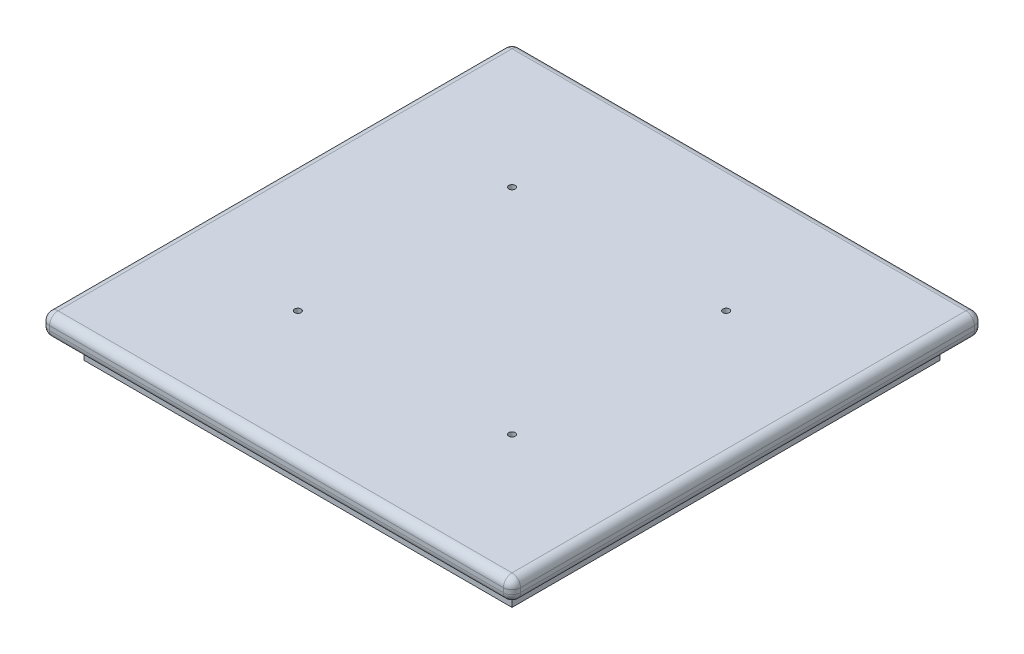
ISO-10303-21;
HEADER;
FILE_DESCRIPTION(('STEP AP214'),'2;1');
FILE_NAME('part.step','',(''),(''),'','','');
FILE_SCHEMA(('AUTOMOTIVE_DESIGN { 1 0 10303 214 1 1 1 1 }'));
ENDSEC;
DATA;
#1=APPLICATION_CONTEXT('core data for automotive mechanical design processes');
#2=APPLICATION_PROTOCOL_DEFINITION('international standard','automotive_design',2000,#1);
#3=PRODUCT_CONTEXT('',#1,'mechanical');
#4=PRODUCT('Part','Part','',(#3));
#5=PRODUCT_RELATED_PRODUCT_CATEGORY('part','',(#4));
#6=PRODUCT_DEFINITION_FORMATION('','',#4);
#7=PRODUCT_DEFINITION_CONTEXT('part definition',#1,'design');
#8=PRODUCT_DEFINITION('design','',#6,#7);
#9=PRODUCT_DEFINITION_SHAPE('','',#8);
#10=(LENGTH_UNIT() NAMED_UNIT(*) SI_UNIT(.MILLI.,.METRE.));
#11=(NAMED_UNIT(*) PLANE_ANGLE_UNIT() SI_UNIT($,.RADIAN.));
#12=(NAMED_UNIT(*) SI_UNIT($,.STERADIAN.) SOLID_ANGLE_UNIT());
#13=UNCERTAINTY_MEASURE_WITH_UNIT(LENGTH_MEASURE(1.E-05),#10,'distance_accuracy_value','');
#14=(GEOMETRIC_REPRESENTATION_CONTEXT(3) GLOBAL_UNCERTAINTY_ASSIGNED_CONTEXT((#13)) GLOBAL_UNIT_ASSIGNED_CONTEXT((#10,
#11,#12)) REPRESENTATION_CONTEXT('',''));
#15=CARTESIAN_POINT('',(0.,0.,0.));
#16=DIRECTION('',(0.,0.,1.));
#17=DIRECTION('',(1.,0.,0.));
#18=AXIS2_PLACEMENT_3D('',#15,#16,#17);
#19=CARTESIAN_POINT('',(-50.,10.,-50.));
#20=DIRECTION('',(1.,0.,0.));
#21=DIRECTION('',(0.,0.,-1.));
#22=AXIS2_PLACEMENT_3D('',#19,#20,#21);
#23=PLANE('',#22);
#24=DIRECTION('',(0.,0.,1.));
#25=VECTOR('',#24,1.);
#26=CARTESIAN_POINT('',(-50.,5.,-50.));
#27=LINE('',#26,#25);
#28=CARTESIAN_POINT('',(-50.,5.,-50.));
#29=VERTEX_POINT('',#28);
#30=CARTESIAN_POINT('',(-50.,5.,50.));
#31=VERTEX_POINT('',#30);
#32=EDGE_CURVE('E164',#29,#31,#27,.T.);
#33=ORIENTED_EDGE('',*,*,#32,.F.);
#34=DIRECTION('',(0.,-1.,0.));
#35=VECTOR('',#34,1.);
#36=CARTESIAN_POINT('',(-50.,10.,-50.));
#37=LINE('',#36,#35);
#38=CARTESIAN_POINT('',(-50.,0.,-50.));
#39=VERTEX_POINT('',#38);
#40=EDGE_CURVE('E149',#29,#39,#37,.T.);
#41=ORIENTED_EDGE('',*,*,#40,.T.);
#42=DIRECTION('',(0.,0.,1.));
#43=VECTOR('',#42,1.);
#44=CARTESIAN_POINT('',(-50.,0.,-50.));
#45=LINE('',#44,#43);
#46=CARTESIAN_POINT('',(-50.,0.,50.));
#47=VERTEX_POINT('',#46);
#48=EDGE_CURVE('E199',#39,#47,#45,.T.);
#49=ORIENTED_EDGE('',*,*,#48,.T.);
#50=DIRECTION('',(0.,-1.,0.));
#51=VECTOR('',#50,1.);
#52=CARTESIAN_POINT('',(-50.,10.,50.));
#53=LINE('',#52,#51);
#54=EDGE_CURVE('E165',#31,#47,#53,.T.);
#55=ORIENTED_EDGE('',*,*,#54,.F.);
#56=EDGE_LOOP('',(#33,#41,#49,#55));
#57=FACE_BOUND('',#56,.T.);
#58=ADVANCED_FACE('F37',(#57),#23,.F.);
#59=CARTESIAN_POINT('',(50.,10.,50.));
#60=DIRECTION('',(0.,0.,-1.));
#61=DIRECTION('',(-1.,0.,0.));
#62=AXIS2_PLACEMENT_3D('',#59,#60,#61);
#63=PLANE('',#62);
#64=DIRECTION('',(1.,0.,0.));
#65=VECTOR('',#64,1.);
#66=CARTESIAN_POINT('',(50.,5.,50.));
#67=LINE('',#66,#65);
#68=CARTESIAN_POINT('',(50.,5.,50.));
#69=VERTEX_POINT('',#68);
#70=EDGE_CURVE('E168',#31,#69,#67,.T.);
#71=ORIENTED_EDGE('',*,*,#70,.F.);
#72=ORIENTED_EDGE('',*,*,#54,.T.);
#73=DIRECTION('',(1.,0.,0.));
#74=VECTOR('',#73,1.);
#75=CARTESIAN_POINT('',(50.,0.,50.));
#76=LINE('',#75,#74);
#77=CARTESIAN_POINT('',(50.,0.,50.));
#78=VERTEX_POINT('',#77);
#79=EDGE_CURVE('E203',#47,#78,#76,.T.);
#80=ORIENTED_EDGE('',*,*,#79,.T.);
#81=DIRECTION('',(0.,-1.,0.));
#82=VECTOR('',#81,1.);
#83=CARTESIAN_POINT('',(50.,10.,50.));
#84=LINE('',#83,#82);
#85=EDGE_CURVE('E211',#69,#78,#84,.T.);
#86=ORIENTED_EDGE('',*,*,#85,.F.);
#87=EDGE_LOOP('',(#71,#72,#80,#86));
#88=FACE_BOUND('',#87,.T.);
#89=ADVANCED_FACE('F421',(#88),#63,.F.);
#90=CARTESIAN_POINT('',(50.,10.,-50.));
#91=DIRECTION('',(-1.,0.,0.));
#92=DIRECTION('',(0.,0.,1.));
#93=AXIS2_PLACEMENT_3D('',#90,#91,#92);
#94=PLANE('',#93);
#95=DIRECTION('',(0.,0.,-1.));
#96=VECTOR('',#95,1.);
#97=CARTESIAN_POINT('',(50.,5.,-50.));
#98=LINE('',#97,#96);
#99=CARTESIAN_POINT('',(50.,5.,-50.));
#100=VERTEX_POINT('',#99);
#101=EDGE_CURVE('E172',#69,#100,#98,.T.);
#102=ORIENTED_EDGE('',*,*,#101,.F.);
#103=ORIENTED_EDGE('',*,*,#85,.T.);
#104=DIRECTION('',(0.,0.,-1.));
#105=VECTOR('',#104,1.);
#106=CARTESIAN_POINT('',(50.,0.,-50.));
#107=LINE('',#106,#105);
#108=CARTESIAN_POINT('',(50.,0.,-50.));
#109=VERTEX_POINT('',#108);
#110=EDGE_CURVE('E206',#78,#109,#107,.T.);
#111=ORIENTED_EDGE('',*,*,#110,.T.);
#112=DIRECTION('',(0.,-1.,0.));
#113=VECTOR('',#112,1.);
#114=CARTESIAN_POINT('',(50.,10.,-50.));
#115=LINE('',#114,#113);
#116=EDGE_CURVE('E160',#100,#109,#115,.T.);
#117=ORIENTED_EDGE('',*,*,#116,.F.);
#118=EDGE_LOOP('',(#102,#103,#111,#117));
#119=FACE_BOUND('',#118,.T.);
#120=ADVANCED_FACE('F426',(#119),#94,.F.);
#121=CARTESIAN_POINT('',(50.,10.,-50.));
#122=DIRECTION('',(0.,0.,1.));
#123=DIRECTION('',(1.,0.,0.));
#124=AXIS2_PLACEMENT_3D('',#121,#122,#123);
#125=PLANE('',#124);
#126=DIRECTION('',(-1.,0.,0.));
#127=VECTOR('',#126,1.);
#128=CARTESIAN_POINT('',(50.,5.,-50.));
#129=LINE('',#128,#127);
#130=EDGE_CURVE('E153',#100,#29,#129,.T.);
#131=ORIENTED_EDGE('',*,*,#130,.F.);
#132=ORIENTED_EDGE('',*,*,#116,.T.);
#133=DIRECTION('',(-1.,0.,0.));
#134=VECTOR('',#133,1.);
#135=CARTESIAN_POINT('',(50.,0.,-50.));
#136=LINE('',#135,#134);
#137=EDGE_CURVE('E156',#109,#39,#136,.T.);
#138=ORIENTED_EDGE('',*,*,#137,.T.);
#139=ORIENTED_EDGE('',*,*,#40,.F.);
#140=EDGE_LOOP('',(#131,#132,#138,#139));
#141=FACE_BOUND('',#140,.T.);
#142=ADVANCED_FACE('F151',(#141),#125,.F.);
#143=CARTESIAN_POINT('',(0.,10.,0.));
#144=DIRECTION('',(0.,-1.,0.));
#145=DIRECTION('',(0.,0.,-1.));
#146=AXIS2_PLACEMENT_3D('',#143,#144,#145);
#147=PLANE('',#146);
#148=DIRECTION('',(-1.,0.,0.));
#149=VECTOR('',#148,1.);
#150=CARTESIAN_POINT('',(-55.,10.,-53.));
#151=LINE('',#150,#149);
#152=CARTESIAN_POINT('',(53.,10.,-53.));
#153=VERTEX_POINT('',#152);
#154=CARTESIAN_POINT('',(-53.,10.,-53.));
#155=VERTEX_POINT('',#154);
#156=EDGE_CURVE('E232',#153,#155,#151,.T.);
#157=ORIENTED_EDGE('',*,*,#156,.T.);
#158=DIRECTION('',(0.,0.,1.));
#159=VECTOR('',#158,1.);
#160=CARTESIAN_POINT('',(-53.,10.,55.));
#161=LINE('',#160,#159);
#162=CARTESIAN_POINT('',(-53.,10.,53.));
#163=VERTEX_POINT('',#162);
#164=EDGE_CURVE('E238',#155,#163,#161,.T.);
#165=ORIENTED_EDGE('',*,*,#164,.T.);
#166=DIRECTION('',(1.,0.,0.));
#167=VECTOR('',#166,1.);
#168=CARTESIAN_POINT('',(55.,10.,53.));
#169=LINE('',#168,#167);
#170=CARTESIAN_POINT('',(53.,10.,53.));
#171=VERTEX_POINT('',#170);
#172=EDGE_CURVE('E236',#163,#171,#169,.T.);
#173=ORIENTED_EDGE('',*,*,#172,.T.);
#174=DIRECTION('',(0.,0.,-1.));
#175=VECTOR('',#174,1.);
#176=CARTESIAN_POINT('',(53.,10.,-55.));
#177=LINE('',#176,#175);
#178=EDGE_CURVE('E234',#171,#153,#177,.T.);
#179=ORIENTED_EDGE('',*,*,#178,.T.);
#180=EDGE_LOOP('',(#157,#165,#173,#179));
#181=FACE_BOUND('',#180,.T.);
#182=CARTESIAN_POINT('',(-25.,10.,-25.));
#183=DIRECTION('',(0.,1.,0.));
#184=DIRECTION('',(0.,0.,1.));
#185=AXIS2_PLACEMENT_3D('',#182,#183,#184);
#186=CIRCLE('',#185,0.750000000000002);
#187=CARTESIAN_POINT('',(-25.,10.,-24.25));
#188=VERTEX_POINT('',#187);
#189=EDGE_CURVE('E196',#188,#188,#186,.T.);
#190=ORIENTED_EDGE('',*,*,#189,.F.);
#191=EDGE_LOOP('',(#190));
#192=FACE_BOUND('',#191,.T.);
#193=CARTESIAN_POINT('',(25.,10.,25.));
#194=DIRECTION('',(0.,1.,0.));
#195=DIRECTION('',(0.,0.,-1.));
#196=AXIS2_PLACEMENT_3D('',#193,#194,#195);
#197=CIRCLE('',#196,0.75);
#198=CARTESIAN_POINT('',(25.,10.,24.25));
#199=VERTEX_POINT('',#198);
#200=EDGE_CURVE('E190',#199,#199,#197,.T.);
#201=ORIENTED_EDGE('',*,*,#200,.F.);
#202=EDGE_LOOP('',(#201));
#203=FACE_BOUND('',#202,.T.);
#204=CARTESIAN_POINT('',(25.,10.,-25.));
#205=DIRECTION('',(0.,1.,0.));
#206=DIRECTION('',(0.,0.,1.));
#207=AXIS2_PLACEMENT_3D('',#204,#205,#206);
#208=CIRCLE('',#207,0.75);
#209=CARTESIAN_POINT('',(25.,10.,-24.25));
#210=VERTEX_POINT('',#209);
#211=EDGE_CURVE('E184',#210,#210,#208,.T.);
#212=ORIENTED_EDGE('',*,*,#211,.F.);
#213=EDGE_LOOP('',(#212));
#214=FACE_BOUND('',#213,.T.);
#215=CARTESIAN_POINT('',(-25.,10.,25.));
#216=DIRECTION('',(0.,1.,0.));
#217=DIRECTION('',(0.,0.,-1.));
#218=AXIS2_PLACEMENT_3D('',#215,#216,#217);
#219=CIRCLE('',#218,0.75);
#220=CARTESIAN_POINT('',(-25.,10.,24.25));
#221=VERTEX_POINT('',#220);
#222=EDGE_CURVE('E176',#221,#221,#219,.T.);
#223=ORIENTED_EDGE('',*,*,#222,.F.);
#224=EDGE_LOOP('',(#223));
#225=FACE_BOUND('',#224,.T.);
#226=ADVANCED_FACE('F365',(#181,#192,#203,#214,#225),#147,.F.);
#227=CARTESIAN_POINT('',(0.,0.,0.));
#228=DIRECTION('',(0.,-1.,0.));
#229=DIRECTION('',(0.,0.,-1.));
#230=AXIS2_PLACEMENT_3D('',#227,#228,#229);
#231=PLANE('',#230);
#232=CARTESIAN_POINT('',(25.,0.,-25.));
#233=DIRECTION('',(0.,1.,0.));
#234=DIRECTION('',(0.,0.,1.));
#235=AXIS2_PLACEMENT_3D('',#232,#233,#234);
#236=CIRCLE('',#235,0.75);
#237=CARTESIAN_POINT('',(25.,0.,-24.25));
#238=VERTEX_POINT('',#237);
#239=EDGE_CURVE('E182',#238,#238,#236,.T.);
#240=ORIENTED_EDGE('',*,*,#239,.T.);
#241=EDGE_LOOP('',(#240));
#242=FACE_BOUND('',#241,.T.);
#243=CARTESIAN_POINT('',(-25.,0.,-25.));
#244=DIRECTION('',(0.,1.,0.));
#245=DIRECTION('',(0.,0.,1.));
#246=AXIS2_PLACEMENT_3D('',#243,#244,#245);
#247=CIRCLE('',#246,0.750000000000002);
#248=CARTESIAN_POINT('',(-25.,0.,-24.25));
#249=VERTEX_POINT('',#248);
#250=EDGE_CURVE('E193',#249,#249,#247,.T.);
#251=ORIENTED_EDGE('',*,*,#250,.T.);
#252=EDGE_LOOP('',(#251));
#253=FACE_BOUND('',#252,.T.);
#254=ORIENTED_EDGE('',*,*,#48,.F.);
#255=ORIENTED_EDGE('',*,*,#137,.F.);
#256=ORIENTED_EDGE('',*,*,#110,.F.);
#257=ORIENTED_EDGE('',*,*,#79,.F.);
#258=EDGE_LOOP('',(#254,#255,#256,#257));
#259=FACE_BOUND('',#258,.T.);
#260=CARTESIAN_POINT('',(25.,0.,25.));
#261=DIRECTION('',(0.,1.,0.));
#262=DIRECTION('',(0.,0.,-1.));
#263=AXIS2_PLACEMENT_3D('',#260,#261,#262);
#264=CIRCLE('',#263,0.75);
#265=CARTESIAN_POINT('',(25.,0.,24.25));
#266=VERTEX_POINT('',#265);
#267=EDGE_CURVE('E187',#266,#266,#264,.T.);
#268=ORIENTED_EDGE('',*,*,#267,.T.);
#269=EDGE_LOOP('',(#268));
#270=FACE_BOUND('',#269,.T.);
#271=CARTESIAN_POINT('',(-25.,0.,25.));
#272=DIRECTION('',(0.,1.,0.));
#273=DIRECTION('',(0.,0.,-1.));
#274=AXIS2_PLACEMENT_3D('',#271,#272,#273);
#275=CIRCLE('',#274,0.75);
#276=CARTESIAN_POINT('',(-25.,0.,24.25));
#277=VERTEX_POINT('',#276);
#278=EDGE_CURVE('E173',#277,#277,#275,.T.);
#279=ORIENTED_EDGE('',*,*,#278,.T.);
#280=EDGE_LOOP('',(#279));
#281=FACE_BOUND('',#280,.T.);
#282=ADVANCED_FACE('F524',(#242,#253,#259,#270,#281),#231,.T.);
#283=CARTESIAN_POINT('',(-25.,10.,-25.));
#284=DIRECTION('',(0.,-1.,0.));
#285=DIRECTION('',(0.,0.,-1.));
#286=AXIS2_PLACEMENT_3D('',#283,#284,#285);
#287=CYLINDRICAL_SURFACE('',#286,0.750000000000002);
#288=ORIENTED_EDGE('',*,*,#189,.T.);
#289=EDGE_LOOP('',(#288));
#290=FACE_BOUND('',#289,.T.);
#291=ORIENTED_EDGE('',*,*,#250,.F.);
#292=EDGE_LOOP('',(#291));
#293=FACE_BOUND('',#292,.T.);
#294=ADVANCED_FACE('F582',(#290,#293),#287,.F.);
#295=CARTESIAN_POINT('',(25.,10.,25.));
#296=DIRECTION('',(0.,-1.,0.));
#297=DIRECTION('',(0.,0.,-1.));
#298=AXIS2_PLACEMENT_3D('',#295,#296,#297);
#299=CYLINDRICAL_SURFACE('',#298,0.75);
#300=ORIENTED_EDGE('',*,*,#200,.T.);
#301=EDGE_LOOP('',(#300));
#302=FACE_BOUND('',#301,.T.);
#303=ORIENTED_EDGE('',*,*,#267,.F.);
#304=EDGE_LOOP('',(#303));
#305=FACE_BOUND('',#304,.T.);
#306=ADVANCED_FACE('F571',(#302,#305),#299,.F.);
#307=CARTESIAN_POINT('',(25.,10.,-25.));
#308=DIRECTION('',(0.,-1.,0.));
#309=DIRECTION('',(0.,0.,-1.));
#310=AXIS2_PLACEMENT_3D('',#307,#308,#309);
#311=CYLINDRICAL_SURFACE('',#310,0.75);
#312=ORIENTED_EDGE('',*,*,#211,.T.);
#313=EDGE_LOOP('',(#312));
#314=FACE_BOUND('',#313,.T.);
#315=ORIENTED_EDGE('',*,*,#239,.F.);
#316=EDGE_LOOP('',(#315));
#317=FACE_BOUND('',#316,.T.);
#318=ADVANCED_FACE('F561',(#314,#317),#311,.F.);
#319=CARTESIAN_POINT('',(-25.,10.,25.));
#320=DIRECTION('',(0.,-1.,0.));
#321=DIRECTION('',(0.,0.,-1.));
#322=AXIS2_PLACEMENT_3D('',#319,#320,#321);
#323=CYLINDRICAL_SURFACE('',#322,0.75);
#324=ORIENTED_EDGE('',*,*,#222,.T.);
#325=EDGE_LOOP('',(#324));
#326=FACE_BOUND('',#325,.T.);
#327=ORIENTED_EDGE('',*,*,#278,.F.);
#328=EDGE_LOOP('',(#327));
#329=FACE_BOUND('',#328,.T.);
#330=ADVANCED_FACE('F514',(#326,#329),#323,.F.);
#331=CARTESIAN_POINT('',(55.,5.,-55.));
#332=DIRECTION('',(0.,0.,-1.));
#333=DIRECTION('',(-1.,0.,0.));
#334=AXIS2_PLACEMENT_3D('',#331,#332,#333);
#335=PLANE('',#334);
#336=DIRECTION('',(-1.,0.,0.));
#337=VECTOR('',#336,1.);
#338=CARTESIAN_POINT('',(-55.,7.,-55.));
#339=LINE('',#338,#337);
#340=CARTESIAN_POINT('',(53.,7.,-55.));
#341=VERTEX_POINT('',#340);
#342=CARTESIAN_POINT('',(-53.,7.,-55.));
#343=VERTEX_POINT('',#342);
#344=EDGE_CURVE('E46',#341,#343,#339,.T.);
#345=ORIENTED_EDGE('',*,*,#344,.T.);
#346=DIRECTION('',(0.,1.,0.));
#347=VECTOR('',#346,1.);
#348=CARTESIAN_POINT('',(-53.,5.,-55.));
#349=LINE('',#348,#347);
#350=CARTESIAN_POINT('',(-53.,8.,-55.));
#351=VERTEX_POINT('',#350);
#352=EDGE_CURVE('E11',#343,#351,#349,.T.);
#353=ORIENTED_EDGE('',*,*,#352,.T.);
#354=DIRECTION('',(-1.,0.,0.));
#355=VECTOR('',#354,1.);
#356=CARTESIAN_POINT('',(55.,8.,-55.));
#357=LINE('',#356,#355);
#358=CARTESIAN_POINT('',(53.,8.,-55.));
#359=VERTEX_POINT('',#358);
#360=EDGE_CURVE('E259',#351,#359,#357,.F.);
#361=ORIENTED_EDGE('',*,*,#360,.T.);
#362=DIRECTION('',(0.,1.,0.));
#363=VECTOR('',#362,1.);
#364=CARTESIAN_POINT('',(53.,5.,-55.));
#365=LINE('',#364,#363);
#366=EDGE_CURVE('E57',#359,#341,#365,.F.);
#367=ORIENTED_EDGE('',*,*,#366,.T.);
#368=EDGE_LOOP('',(#345,#353,#361,#367));
#369=FACE_BOUND('',#368,.T.);
#370=ADVANCED_FACE('F358',(#369),#335,.T.);
#371=CARTESIAN_POINT('',(55.,5.,55.));
#372=DIRECTION('',(1.,0.,0.));
#373=DIRECTION('',(0.,0.,-1.));
#374=AXIS2_PLACEMENT_3D('',#371,#372,#373);
#375=PLANE('',#374);
#376=DIRECTION('',(0.,1.,0.));
#377=VECTOR('',#376,1.);
#378=CARTESIAN_POINT('',(55.,5.,53.));
#379=LINE('',#378,#377);
#380=CARTESIAN_POINT('',(55.,8.,53.));
#381=VERTEX_POINT('',#380);
#382=CARTESIAN_POINT('',(55.,7.,53.));
#383=VERTEX_POINT('',#382);
#384=EDGE_CURVE('E254',#381,#383,#379,.F.);
#385=ORIENTED_EDGE('',*,*,#384,.T.);
#386=DIRECTION('',(0.,0.,-1.));
#387=VECTOR('',#386,1.);
#388=CARTESIAN_POINT('',(55.,7.,-55.));
#389=LINE('',#388,#387);
#390=CARTESIAN_POINT('',(55.,7.,-53.));
#391=VERTEX_POINT('',#390);
#392=EDGE_CURVE('E256',#383,#391,#389,.T.);
#393=ORIENTED_EDGE('',*,*,#392,.T.);
#394=DIRECTION('',(0.,1.,0.));
#395=VECTOR('',#394,1.);
#396=CARTESIAN_POINT('',(55.,5.,-53.));
#397=LINE('',#396,#395);
#398=CARTESIAN_POINT('',(55.,8.,-53.));
#399=VERTEX_POINT('',#398);
#400=EDGE_CURVE('E250',#391,#399,#397,.T.);
#401=ORIENTED_EDGE('',*,*,#400,.T.);
#402=DIRECTION('',(0.,0.,-1.));
#403=VECTOR('',#402,1.);
#404=CARTESIAN_POINT('',(55.,8.,55.));
#405=LINE('',#404,#403);
#406=EDGE_CURVE('E252',#399,#381,#405,.F.);
#407=ORIENTED_EDGE('',*,*,#406,.T.);
#408=EDGE_LOOP('',(#385,#393,#401,#407));
#409=FACE_BOUND('',#408,.T.);
#410=ADVANCED_FACE('F387',(#409),#375,.T.);
#411=CARTESIAN_POINT('',(-55.,5.,55.));
#412=DIRECTION('',(0.,0.,1.));
#413=DIRECTION('',(1.,0.,0.));
#414=AXIS2_PLACEMENT_3D('',#411,#412,#413);
#415=PLANE('',#414);
#416=DIRECTION('',(0.,1.,0.));
#417=VECTOR('',#416,1.);
#418=CARTESIAN_POINT('',(-53.,5.,55.));
#419=LINE('',#418,#417);
#420=CARTESIAN_POINT('',(-53.,8.,55.));
#421=VERTEX_POINT('',#420);
#422=CARTESIAN_POINT('',(-53.,7.,55.));
#423=VERTEX_POINT('',#422);
#424=EDGE_CURVE('E245',#421,#423,#419,.F.);
#425=ORIENTED_EDGE('',*,*,#424,.T.);
#426=DIRECTION('',(1.,0.,0.));
#427=VECTOR('',#426,1.);
#428=CARTESIAN_POINT('',(55.,7.,55.));
#429=LINE('',#428,#427);
#430=CARTESIAN_POINT('',(53.,7.,55.));
#431=VERTEX_POINT('',#430);
#432=EDGE_CURVE('E247',#423,#431,#429,.T.);
#433=ORIENTED_EDGE('',*,*,#432,.T.);
#434=DIRECTION('',(0.,1.,0.));
#435=VECTOR('',#434,1.);
#436=CARTESIAN_POINT('',(53.,5.,55.));
#437=LINE('',#436,#435);
#438=CARTESIAN_POINT('',(53.,8.,55.));
#439=VERTEX_POINT('',#438);
#440=EDGE_CURVE('E241',#431,#439,#437,.T.);
#441=ORIENTED_EDGE('',*,*,#440,.T.);
#442=DIRECTION('',(1.,0.,0.));
#443=VECTOR('',#442,1.);
#444=CARTESIAN_POINT('',(-55.,8.,55.));
#445=LINE('',#444,#443);
#446=EDGE_CURVE('E243',#439,#421,#445,.F.);
#447=ORIENTED_EDGE('',*,*,#446,.T.);
#448=EDGE_LOOP('',(#425,#433,#441,#447));
#449=FACE_BOUND('',#448,.T.);
#450=ADVANCED_FACE('F410',(#449),#415,.T.);
#451=CARTESIAN_POINT('',(-55.,5.,-55.));
#452=DIRECTION('',(-1.,0.,0.));
#453=DIRECTION('',(0.,0.,1.));
#454=AXIS2_PLACEMENT_3D('',#451,#452,#453);
#455=PLANE('',#454);
#456=DIRECTION('',(0.,0.,1.));
#457=VECTOR('',#456,1.);
#458=CARTESIAN_POINT('',(-55.,7.,55.));
#459=LINE('',#458,#457);
#460=CARTESIAN_POINT('',(-55.,7.,-53.));
#461=VERTEX_POINT('',#460);
#462=CARTESIAN_POINT('',(-55.,7.,53.));
#463=VERTEX_POINT('',#462);
#464=EDGE_CURVE('E218',#461,#463,#459,.T.);
#465=ORIENTED_EDGE('',*,*,#464,.T.);
#466=DIRECTION('',(0.,1.,0.));
#467=VECTOR('',#466,1.);
#468=CARTESIAN_POINT('',(-55.,5.,53.));
#469=LINE('',#468,#467);
#470=CARTESIAN_POINT('',(-55.,8.,53.));
#471=VERTEX_POINT('',#470);
#472=EDGE_CURVE('E221',#463,#471,#469,.T.);
#473=ORIENTED_EDGE('',*,*,#472,.T.);
#474=DIRECTION('',(0.,0.,1.));
#475=VECTOR('',#474,1.);
#476=CARTESIAN_POINT('',(-55.,8.,-55.));
#477=LINE('',#476,#475);
#478=CARTESIAN_POINT('',(-55.,8.,-53.));
#479=VERTEX_POINT('',#478);
#480=EDGE_CURVE('E216',#471,#479,#477,.F.);
#481=ORIENTED_EDGE('',*,*,#480,.T.);
#482=DIRECTION('',(0.,1.,0.));
#483=VECTOR('',#482,1.);
#484=CARTESIAN_POINT('',(-55.,5.,-53.));
#485=LINE('',#484,#483);
#486=EDGE_CURVE('E214',#479,#461,#485,.F.);
#487=ORIENTED_EDGE('',*,*,#486,.T.);
#488=EDGE_LOOP('',(#465,#473,#481,#487));
#489=FACE_BOUND('',#488,.T.);
#490=ADVANCED_FACE('F408',(#489),#455,.T.);
#491=CARTESIAN_POINT('',(0.,5.,0.));
#492=DIRECTION('',(0.,1.,0.));
#493=DIRECTION('',(0.,0.,1.));
#494=AXIS2_PLACEMENT_3D('',#491,#492,#493);
#495=PLANE('',#494);
#496=DIRECTION('',(1.,0.,0.));
#497=VECTOR('',#496,1.);
#498=CARTESIAN_POINT('',(-55.,5.,53.));
#499=LINE('',#498,#497);
#500=CARTESIAN_POINT('',(53.,5.,53.));
#501=VERTEX_POINT('',#500);
#502=CARTESIAN_POINT('',(-53.,5.,53.));
#503=VERTEX_POINT('',#502);
#504=EDGE_CURVE('E227',#501,#503,#499,.F.);
#505=ORIENTED_EDGE('',*,*,#504,.T.);
#506=DIRECTION('',(0.,0.,1.));
#507=VECTOR('',#506,1.);
#508=CARTESIAN_POINT('',(-53.,5.,-55.));
#509=LINE('',#508,#507);
#510=CARTESIAN_POINT('',(-53.,5.,-53.));
#511=VERTEX_POINT('',#510);
#512=EDGE_CURVE('E229',#503,#511,#509,.F.);
#513=ORIENTED_EDGE('',*,*,#512,.T.);
#514=DIRECTION('',(-1.,0.,0.));
#515=VECTOR('',#514,1.);
#516=CARTESIAN_POINT('',(55.,5.,-53.));
#517=LINE('',#516,#515);
#518=CARTESIAN_POINT('',(53.,5.,-53.));
#519=VERTEX_POINT('',#518);
#520=EDGE_CURVE('E223',#511,#519,#517,.F.);
#521=ORIENTED_EDGE('',*,*,#520,.T.);
#522=DIRECTION('',(0.,0.,-1.));
#523=VECTOR('',#522,1.);
#524=CARTESIAN_POINT('',(53.,5.,55.));
#525=LINE('',#524,#523);
#526=EDGE_CURVE('E225',#519,#501,#525,.F.);
#527=ORIENTED_EDGE('',*,*,#526,.T.);
#528=EDGE_LOOP('',(#505,#513,#521,#527));
#529=FACE_BOUND('',#528,.T.);
#530=ORIENTED_EDGE('',*,*,#130,.T.);
#531=ORIENTED_EDGE('',*,*,#32,.T.);
#532=ORIENTED_EDGE('',*,*,#70,.T.);
#533=ORIENTED_EDGE('',*,*,#101,.T.);
#534=EDGE_LOOP('',(#530,#531,#532,#533));
#535=FACE_BOUND('',#534,.T.);
#536=ADVANCED_FACE('F171',(#529,#535),#495,.F.);
#537=CARTESIAN_POINT('',(53.,8.,0.));
#538=DIRECTION('',(0.,0.,1.));
#539=DIRECTION('',(1.,0.,0.));
#540=AXIS2_PLACEMENT_3D('',#537,#538,#539);
#541=CYLINDRICAL_SURFACE('',#540,2.);
#542=CARTESIAN_POINT('',(53.,8.,-53.));
#543=DIRECTION('',(0.,0.,-1.));
#544=DIRECTION('',(-1.,0.,0.));
#545=AXIS2_PLACEMENT_3D('',#542,#543,#544);
#546=CIRCLE('',#545,2.);
#547=EDGE_CURVE('E41',#153,#399,#546,.T.);
#548=ORIENTED_EDGE('',*,*,#547,.F.);
#549=ORIENTED_EDGE('',*,*,#178,.F.);
#550=CARTESIAN_POINT('',(53.,8.,53.));
#551=DIRECTION('',(0.,0.,1.));
#552=DIRECTION('',(1.,0.,0.));
#553=AXIS2_PLACEMENT_3D('',#550,#551,#552);
#554=CIRCLE('',#553,2.);
#555=EDGE_CURVE('E322',#381,#171,#554,.T.);
#556=ORIENTED_EDGE('',*,*,#555,.F.);
#557=ORIENTED_EDGE('',*,*,#406,.F.);
#558=EDGE_LOOP('',(#548,#549,#556,#557));
#559=FACE_BOUND('',#558,.T.);
#560=ADVANCED_FACE('F39',(#559),#541,.T.);
#561=CARTESIAN_POINT('',(53.,8.,-53.));
#562=DIRECTION('',(1.,0.,0.));
#563=DIRECTION('',(0.,0.,-1.));
#564=AXIS2_PLACEMENT_3D('',#561,#562,#563);
#565=SPHERICAL_SURFACE('',#564,2.);
#566=CARTESIAN_POINT('',(53.,8.,-53.));
#567=DIRECTION('',(1.,0.,0.));
#568=DIRECTION('',(0.,0.,-1.));
#569=AXIS2_PLACEMENT_3D('',#566,#567,#568);
#570=CIRCLE('',#569,2.);
#571=EDGE_CURVE('E317',#153,#359,#570,.F.);
#572=ORIENTED_EDGE('',*,*,#571,.F.);
#573=ORIENTED_EDGE('',*,*,#547,.T.);
#574=CARTESIAN_POINT('',(53.,8.,-53.));
#575=DIRECTION('',(0.,1.,0.));
#576=DIRECTION('',(0.,0.,1.));
#577=AXIS2_PLACEMENT_3D('',#574,#575,#576);
#578=CIRCLE('',#577,2.);
#579=EDGE_CURVE('E320',#359,#399,#578,.F.);
#580=ORIENTED_EDGE('',*,*,#579,.F.);
#581=EDGE_LOOP('',(#572,#573,#580));
#582=FACE_BOUND('',#581,.T.);
#583=ADVANCED_FACE('F333',(#582),#565,.T.);
#584=CARTESIAN_POINT('',(53.,8.,53.));
#585=DIRECTION('',(0.,1.,0.));
#586=DIRECTION('',(0.,0.,1.));
#587=AXIS2_PLACEMENT_3D('',#584,#585,#586);
#588=SPHERICAL_SURFACE('',#587,2.);
#589=CARTESIAN_POINT('',(53.,8.,53.));
#590=DIRECTION('',(0.,1.,0.));
#591=DIRECTION('',(0.,0.,1.));
#592=AXIS2_PLACEMENT_3D('',#589,#590,#591);
#593=CIRCLE('',#592,2.);
#594=EDGE_CURVE('E311',#381,#439,#593,.F.);
#595=ORIENTED_EDGE('',*,*,#594,.F.);
#596=ORIENTED_EDGE('',*,*,#555,.T.);
#597=CARTESIAN_POINT('',(53.,8.,53.));
#598=DIRECTION('',(1.,0.,0.));
#599=DIRECTION('',(0.,0.,-1.));
#600=AXIS2_PLACEMENT_3D('',#597,#598,#599);
#601=CIRCLE('',#600,2.);
#602=EDGE_CURVE('E314',#439,#171,#601,.F.);
#603=ORIENTED_EDGE('',*,*,#602,.F.);
#604=EDGE_LOOP('',(#595,#596,#603));
#605=FACE_BOUND('',#604,.T.);
#606=ADVANCED_FACE('F380',(#605),#588,.T.);
#607=CARTESIAN_POINT('',(53.,5.,-53.));
#608=DIRECTION('',(0.,1.,0.));
#609=DIRECTION('',(0.,0.,1.));
#610=AXIS2_PLACEMENT_3D('',#607,#608,#609);
#611=CYLINDRICAL_SURFACE('',#610,2.);
#612=ORIENTED_EDGE('',*,*,#579,.T.);
#613=ORIENTED_EDGE('',*,*,#400,.F.);
#614=CARTESIAN_POINT('',(53.,7.,-53.));
#615=DIRECTION('',(0.,-1.,0.));
#616=DIRECTION('',(0.,0.,-1.));
#617=AXIS2_PLACEMENT_3D('',#614,#615,#616);
#618=CIRCLE('',#617,2.);
#619=EDGE_CURVE('E306',#341,#391,#618,.T.);
#620=ORIENTED_EDGE('',*,*,#619,.F.);
#621=ORIENTED_EDGE('',*,*,#366,.F.);
#622=EDGE_LOOP('',(#612,#613,#620,#621));
#623=FACE_BOUND('',#622,.T.);
#624=ADVANCED_FACE('F340',(#623),#611,.T.);
#625=CARTESIAN_POINT('',(0.,8.,-53.));
#626=DIRECTION('',(1.,0.,0.));
#627=DIRECTION('',(0.,0.,-1.));
#628=AXIS2_PLACEMENT_3D('',#625,#626,#627);
#629=CYLINDRICAL_SURFACE('',#628,2.);
#630=ORIENTED_EDGE('',*,*,#571,.T.);
#631=ORIENTED_EDGE('',*,*,#360,.F.);
#632=CARTESIAN_POINT('',(-53.,8.,-53.));
#633=DIRECTION('',(-1.,0.,0.));
#634=DIRECTION('',(0.,0.,1.));
#635=AXIS2_PLACEMENT_3D('',#632,#633,#634);
#636=CIRCLE('',#635,2.);
#637=EDGE_CURVE('E303',#155,#351,#636,.T.);
#638=ORIENTED_EDGE('',*,*,#637,.F.);
#639=ORIENTED_EDGE('',*,*,#156,.F.);
#640=EDGE_LOOP('',(#630,#631,#638,#639));
#641=FACE_BOUND('',#640,.T.);
#642=ADVANCED_FACE('F362',(#641),#629,.T.);
#643=CARTESIAN_POINT('',(-53.,8.,0.));
#644=DIRECTION('',(0.,0.,-1.));
#645=DIRECTION('',(-1.,0.,0.));
#646=AXIS2_PLACEMENT_3D('',#643,#644,#645);
#647=CYLINDRICAL_SURFACE('',#646,2.);
#648=CARTESIAN_POINT('',(-53.,8.,53.));
#649=DIRECTION('',(0.,0.,1.));
#650=DIRECTION('',(1.,0.,0.));
#651=AXIS2_PLACEMENT_3D('',#648,#649,#650);
#652=CIRCLE('',#651,2.);
#653=EDGE_CURVE('E297',#163,#471,#652,.T.);
#654=ORIENTED_EDGE('',*,*,#653,.F.);
#655=ORIENTED_EDGE('',*,*,#164,.F.);
#656=CARTESIAN_POINT('',(-53.,8.,-53.));
#657=DIRECTION('',(0.,0.,-1.));
#658=DIRECTION('',(-1.,0.,0.));
#659=AXIS2_PLACEMENT_3D('',#656,#657,#658);
#660=CIRCLE('',#659,2.);
#661=EDGE_CURVE('E300',#479,#155,#660,.T.);
#662=ORIENTED_EDGE('',*,*,#661,.F.);
#663=ORIENTED_EDGE('',*,*,#480,.F.);
#664=EDGE_LOOP('',(#654,#655,#662,#663));
#665=FACE_BOUND('',#664,.T.);
#666=ADVANCED_FACE('F370',(#665),#647,.T.);
#667=CARTESIAN_POINT('',(0.,8.,53.));
#668=DIRECTION('',(-1.,0.,0.));
#669=DIRECTION('',(0.,0.,1.));
#670=AXIS2_PLACEMENT_3D('',#667,#668,#669);
#671=CYLINDRICAL_SURFACE('',#670,2.);
#672=ORIENTED_EDGE('',*,*,#602,.T.);
#673=ORIENTED_EDGE('',*,*,#172,.F.);
#674=CARTESIAN_POINT('',(-53.,8.,53.));
#675=DIRECTION('',(-1.,0.,0.));
#676=DIRECTION('',(0.,0.,1.));
#677=AXIS2_PLACEMENT_3D('',#674,#675,#676);
#678=CIRCLE('',#677,2.);
#679=EDGE_CURVE('E295',#421,#163,#678,.T.);
#680=ORIENTED_EDGE('',*,*,#679,.F.);
#681=ORIENTED_EDGE('',*,*,#446,.F.);
#682=EDGE_LOOP('',(#672,#673,#680,#681));
#683=FACE_BOUND('',#682,.T.);
#684=ADVANCED_FACE('F377',(#683),#671,.T.);
#685=CARTESIAN_POINT('',(53.,5.,53.));
#686=DIRECTION('',(0.,1.,0.));
#687=DIRECTION('',(0.,0.,1.));
#688=AXIS2_PLACEMENT_3D('',#685,#686,#687);
#689=CYLINDRICAL_SURFACE('',#688,2.);
#690=ORIENTED_EDGE('',*,*,#594,.T.);
#691=ORIENTED_EDGE('',*,*,#440,.F.);
#692=CARTESIAN_POINT('',(53.,7.,53.));
#693=DIRECTION('',(0.,-1.,0.));
#694=DIRECTION('',(0.,0.,-1.));
#695=AXIS2_PLACEMENT_3D('',#692,#693,#694);
#696=CIRCLE('',#695,2.);
#697=EDGE_CURVE('E292',#383,#431,#696,.T.);
#698=ORIENTED_EDGE('',*,*,#697,.F.);
#699=ORIENTED_EDGE('',*,*,#384,.F.);
#700=EDGE_LOOP('',(#690,#691,#698,#699));
#701=FACE_BOUND('',#700,.T.);
#702=ADVANCED_FACE('F384',(#701),#689,.T.);
#703=CARTESIAN_POINT('',(53.,7.,55.));
#704=DIRECTION('',(0.,0.,1.));
#705=DIRECTION('',(1.,0.,0.));
#706=AXIS2_PLACEMENT_3D('',#703,#704,#705);
#707=CYLINDRICAL_SURFACE('',#706,2.);
#708=CARTESIAN_POINT('',(53.,7.,-53.));
#709=DIRECTION('',(0.,0.,-1.));
#710=DIRECTION('',(-1.,0.,0.));
#711=AXIS2_PLACEMENT_3D('',#708,#709,#710);
#712=CIRCLE('',#711,2.);
#713=EDGE_CURVE('E308',#391,#519,#712,.T.);
#714=ORIENTED_EDGE('',*,*,#713,.F.);
#715=ORIENTED_EDGE('',*,*,#392,.F.);
#716=CARTESIAN_POINT('',(53.,7.,53.));
#717=DIRECTION('',(0.,0.,1.));
#718=DIRECTION('',(1.,0.,0.));
#719=AXIS2_PLACEMENT_3D('',#716,#717,#718);
#720=CIRCLE('',#719,2.);
#721=EDGE_CURVE('E289',#501,#383,#720,.T.);
#722=ORIENTED_EDGE('',*,*,#721,.F.);
#723=ORIENTED_EDGE('',*,*,#526,.F.);
#724=EDGE_LOOP('',(#714,#715,#722,#723));
#725=FACE_BOUND('',#724,.T.);
#726=ADVANCED_FACE('F390',(#725),#707,.T.);
#727=CARTESIAN_POINT('',(53.,7.,-53.));
#728=DIRECTION('',(1.,0.,0.));
#729=DIRECTION('',(0.,0.,-1.));
#730=AXIS2_PLACEMENT_3D('',#727,#728,#729);
#731=SPHERICAL_SURFACE('',#730,2.);
#732=ORIENTED_EDGE('',*,*,#619,.T.);
#733=ORIENTED_EDGE('',*,*,#713,.T.);
#734=CARTESIAN_POINT('',(53.,7.,-53.));
#735=DIRECTION('',(1.,0.,0.));
#736=DIRECTION('',(0.,0.,-1.));
#737=AXIS2_PLACEMENT_3D('',#734,#735,#736);
#738=CIRCLE('',#737,2.);
#739=EDGE_CURVE('E286',#341,#519,#738,.F.);
#740=ORIENTED_EDGE('',*,*,#739,.F.);
#741=EDGE_LOOP('',(#732,#733,#740));
#742=FACE_BOUND('',#741,.T.);
#743=ADVANCED_FACE('F344',(#742),#731,.T.);
#744=CARTESIAN_POINT('',(-53.,8.,-53.));
#745=DIRECTION('',(0.,1.,0.));
#746=DIRECTION('',(0.,0.,1.));
#747=AXIS2_PLACEMENT_3D('',#744,#745,#746);
#748=SPHERICAL_SURFACE('',#747,2.);
#749=ORIENTED_EDGE('',*,*,#661,.T.);
#750=ORIENTED_EDGE('',*,*,#637,.T.);
#751=CARTESIAN_POINT('',(-53.,8.,-53.));
#752=DIRECTION('',(0.,1.,0.));
#753=DIRECTION('',(0.,0.,1.));
#754=AXIS2_PLACEMENT_3D('',#751,#752,#753);
#755=CIRCLE('',#754,2.);
#756=EDGE_CURVE('E284',#479,#351,#755,.F.);
#757=ORIENTED_EDGE('',*,*,#756,.F.);
#758=EDGE_LOOP('',(#749,#750,#757));
#759=FACE_BOUND('',#758,.T.);
#760=ADVANCED_FACE('F454',(#759),#748,.T.);
#761=CARTESIAN_POINT('',(-53.,8.,53.));
#762=DIRECTION('',(0.,1.,0.));
#763=DIRECTION('',(0.,0.,1.));
#764=AXIS2_PLACEMENT_3D('',#761,#762,#763);
#765=SPHERICAL_SURFACE('',#764,2.);
#766=ORIENTED_EDGE('',*,*,#679,.T.);
#767=ORIENTED_EDGE('',*,*,#653,.T.);
#768=CARTESIAN_POINT('',(-53.,8.,53.));
#769=DIRECTION('',(0.,1.,0.));
#770=DIRECTION('',(0.,0.,1.));
#771=AXIS2_PLACEMENT_3D('',#768,#769,#770);
#772=CIRCLE('',#771,2.);
#773=EDGE_CURVE('E281',#421,#471,#772,.F.);
#774=ORIENTED_EDGE('',*,*,#773,.F.);
#775=EDGE_LOOP('',(#766,#767,#774));
#776=FACE_BOUND('',#775,.T.);
#777=ADVANCED_FACE('F450',(#776),#765,.T.);
#778=CARTESIAN_POINT('',(53.,7.,53.));
#779=DIRECTION('',(1.,0.,0.));
#780=DIRECTION('',(0.,0.,-1.));
#781=AXIS2_PLACEMENT_3D('',#778,#779,#780);
#782=SPHERICAL_SURFACE('',#781,2.);
#783=ORIENTED_EDGE('',*,*,#721,.T.);
#784=ORIENTED_EDGE('',*,*,#697,.T.);
#785=CARTESIAN_POINT('',(53.,7.,53.));
#786=DIRECTION('',(1.,0.,0.));
#787=DIRECTION('',(0.,1.,0.));
#788=AXIS2_PLACEMENT_3D('',#785,#786,#787);
#789=CIRCLE('',#788,2.);
#790=EDGE_CURVE('E279',#501,#431,#789,.F.);
#791=ORIENTED_EDGE('',*,*,#790,.F.);
#792=EDGE_LOOP('',(#783,#784,#791));
#793=FACE_BOUND('',#792,.T.);
#794=ADVANCED_FACE('F447',(#793),#782,.T.);
#795=CARTESIAN_POINT('',(55.,7.,-53.));
#796=DIRECTION('',(1.,0.,0.));
#797=DIRECTION('',(0.,0.,-1.));
#798=AXIS2_PLACEMENT_3D('',#795,#796,#797);
#799=CYLINDRICAL_SURFACE('',#798,2.);
#800=ORIENTED_EDGE('',*,*,#739,.T.);
#801=ORIENTED_EDGE('',*,*,#520,.F.);
#802=CARTESIAN_POINT('',(-53.,7.,-53.));
#803=DIRECTION('',(-1.,0.,0.));
#804=DIRECTION('',(0.,0.,1.));
#805=AXIS2_PLACEMENT_3D('',#802,#803,#804);
#806=CIRCLE('',#805,2.);
#807=EDGE_CURVE('E276',#343,#511,#806,.T.);
#808=ORIENTED_EDGE('',*,*,#807,.F.);
#809=ORIENTED_EDGE('',*,*,#344,.F.);
#810=EDGE_LOOP('',(#800,#801,#808,#809));
#811=FACE_BOUND('',#810,.T.);
#812=ADVANCED_FACE('F348',(#811),#799,.T.);
#813=CARTESIAN_POINT('',(-53.,5.,-53.));
#814=DIRECTION('',(0.,1.,0.));
#815=DIRECTION('',(0.,0.,1.));
#816=AXIS2_PLACEMENT_3D('',#813,#814,#815);
#817=CYLINDRICAL_SURFACE('',#816,2.);
#818=ORIENTED_EDGE('',*,*,#756,.T.);
#819=ORIENTED_EDGE('',*,*,#352,.F.);
#820=CARTESIAN_POINT('',(-53.,7.,-53.));
#821=DIRECTION('',(0.,-1.,0.));
#822=DIRECTION('',(0.,0.,-1.));
#823=AXIS2_PLACEMENT_3D('',#820,#821,#822);
#824=CIRCLE('',#823,2.);
#825=EDGE_CURVE('E273',#461,#343,#824,.T.);
#826=ORIENTED_EDGE('',*,*,#825,.F.);
#827=ORIENTED_EDGE('',*,*,#486,.F.);
#828=EDGE_LOOP('',(#818,#819,#826,#827));
#829=FACE_BOUND('',#828,.T.);
#830=ADVANCED_FACE('F356',(#829),#817,.T.);
#831=CARTESIAN_POINT('',(-53.,5.,53.));
#832=DIRECTION('',(0.,1.,0.));
#833=DIRECTION('',(0.,0.,1.));
#834=AXIS2_PLACEMENT_3D('',#831,#832,#833);
#835=CYLINDRICAL_SURFACE('',#834,2.);
#836=ORIENTED_EDGE('',*,*,#773,.T.);
#837=ORIENTED_EDGE('',*,*,#472,.F.);
#838=CARTESIAN_POINT('',(-53.,7.,53.));
#839=DIRECTION('',(0.,-1.,0.));
#840=DIRECTION('',(0.,0.,-1.));
#841=AXIS2_PLACEMENT_3D('',#838,#839,#840);
#842=CIRCLE('',#841,2.);
#843=EDGE_CURVE('E270',#423,#463,#842,.T.);
#844=ORIENTED_EDGE('',*,*,#843,.F.);
#845=ORIENTED_EDGE('',*,*,#424,.F.);
#846=EDGE_LOOP('',(#836,#837,#844,#845));
#847=FACE_BOUND('',#846,.T.);
#848=ADVANCED_FACE('F406',(#847),#835,.T.);
#849=CARTESIAN_POINT('',(-55.,7.,53.));
#850=DIRECTION('',(-1.,0.,0.));
#851=DIRECTION('',(0.,0.,1.));
#852=AXIS2_PLACEMENT_3D('',#849,#850,#851);
#853=CYLINDRICAL_SURFACE('',#852,2.);
#854=ORIENTED_EDGE('',*,*,#790,.T.);
#855=ORIENTED_EDGE('',*,*,#432,.F.);
#856=CARTESIAN_POINT('',(-53.,7.,53.));
#857=DIRECTION('',(-1.,0.,0.));
#858=DIRECTION('',(0.,0.,1.));
#859=AXIS2_PLACEMENT_3D('',#856,#857,#858);
#860=CIRCLE('',#859,2.);
#861=EDGE_CURVE('E267',#503,#423,#860,.T.);
#862=ORIENTED_EDGE('',*,*,#861,.F.);
#863=ORIENTED_EDGE('',*,*,#504,.F.);
#864=EDGE_LOOP('',(#854,#855,#862,#863));
#865=FACE_BOUND('',#864,.T.);
#866=ADVANCED_FACE('F437',(#865),#853,.T.);
#867=CARTESIAN_POINT('',(-53.,7.,-53.));
#868=DIRECTION('',(0.,0.,-1.));
#869=DIRECTION('',(-1.,0.,0.));
#870=AXIS2_PLACEMENT_3D('',#867,#868,#869);
#871=SPHERICAL_SURFACE('',#870,2.);
#872=ORIENTED_EDGE('',*,*,#825,.T.);
#873=ORIENTED_EDGE('',*,*,#807,.T.);
#874=CARTESIAN_POINT('',(-53.,7.,-53.));
#875=DIRECTION('',(0.,0.,-1.));
#876=DIRECTION('',(-1.,0.,0.));
#877=AXIS2_PLACEMENT_3D('',#874,#875,#876);
#878=CIRCLE('',#877,2.);
#879=EDGE_CURVE('E265',#461,#511,#878,.F.);
#880=ORIENTED_EDGE('',*,*,#879,.F.);
#881=EDGE_LOOP('',(#872,#873,#880));
#882=FACE_BOUND('',#881,.T.);
#883=ADVANCED_FACE('F352',(#882),#871,.T.);
#884=CARTESIAN_POINT('',(-53.,7.,53.));
#885=DIRECTION('',(0.,0.,1.));
#886=DIRECTION('',(1.,0.,0.));
#887=AXIS2_PLACEMENT_3D('',#884,#885,#886);
#888=SPHERICAL_SURFACE('',#887,2.);
#889=ORIENTED_EDGE('',*,*,#861,.T.);
#890=ORIENTED_EDGE('',*,*,#843,.T.);
#891=CARTESIAN_POINT('',(-53.,7.,53.));
#892=DIRECTION('',(0.,0.,1.));
#893=DIRECTION('',(1.,0.,0.));
#894=AXIS2_PLACEMENT_3D('',#891,#892,#893);
#895=CIRCLE('',#894,2.);
#896=EDGE_CURVE('E263',#503,#463,#895,.F.);
#897=ORIENTED_EDGE('',*,*,#896,.F.);
#898=EDGE_LOOP('',(#889,#890,#897));
#899=FACE_BOUND('',#898,.T.);
#900=ADVANCED_FACE('F401',(#899),#888,.T.);
#901=CARTESIAN_POINT('',(-53.,7.,-55.));
#902=DIRECTION('',(0.,0.,-1.));
#903=DIRECTION('',(-1.,0.,0.));
#904=AXIS2_PLACEMENT_3D('',#901,#902,#903);
#905=CYLINDRICAL_SURFACE('',#904,2.);
#906=ORIENTED_EDGE('',*,*,#879,.T.);
#907=ORIENTED_EDGE('',*,*,#512,.F.);
#908=ORIENTED_EDGE('',*,*,#896,.T.);
#909=ORIENTED_EDGE('',*,*,#464,.F.);
#910=EDGE_LOOP('',(#906,#907,#908,#909));
#911=FACE_BOUND('',#910,.T.);
#912=ADVANCED_FACE('F399',(#911),#905,.T.);
#913=CLOSED_SHELL('',(#58,#89,#120,#142,#226,#282,#294,#306,#318,#330,#370,#410,#450,#490,#536,
#560,#583,#606,#624,#642,#666,#684,#702,#726,#743,#760,#777,#794,#812,#830,#848,#866,#883,#900,#912));
#914=MANIFOLD_SOLID_BREP('B2',#913);
#915=ADVANCED_BREP_SHAPE_REPRESENTATION('',(#18,#914),#14);
#916=SHAPE_DEFINITION_REPRESENTATION(#9,#915);
ENDSEC;
END-ISO-10303-21;
